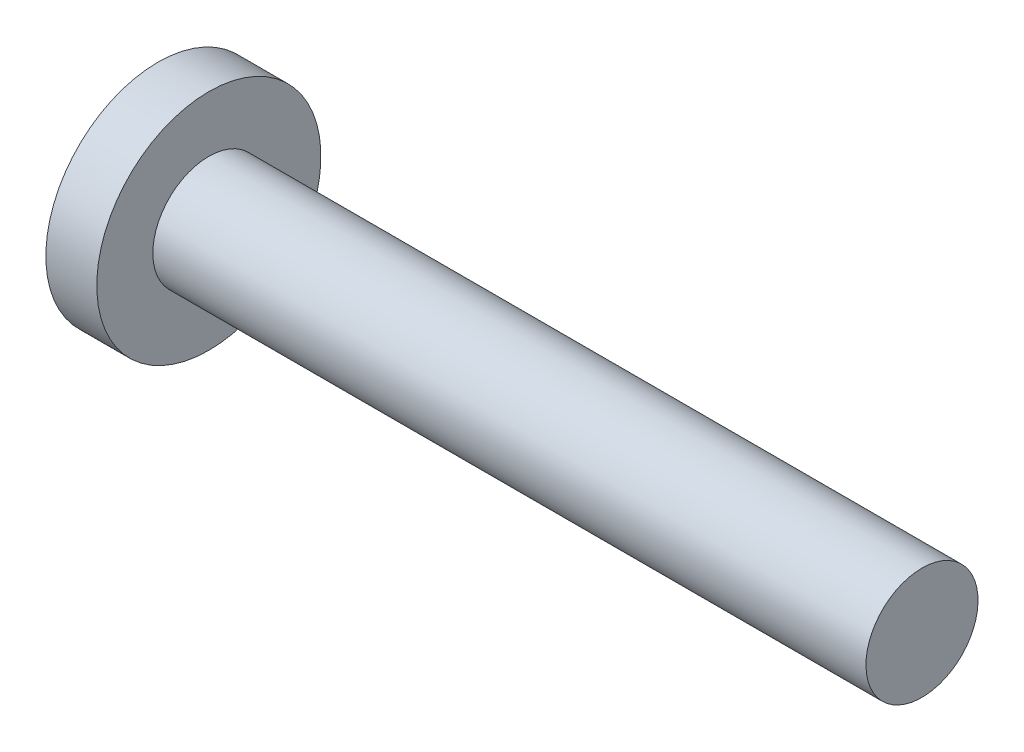
ISO-10303-21;
HEADER;
FILE_DESCRIPTION(('STEP AP214'),'2;1');
FILE_NAME('part.step','',(''),(''),'','','');
FILE_SCHEMA(('AUTOMOTIVE_DESIGN { 1 0 10303 214 1 1 1 1 }'));
ENDSEC;
DATA;
#1=APPLICATION_CONTEXT('core data for automotive mechanical design processes');
#2=APPLICATION_PROTOCOL_DEFINITION('international standard','automotive_design',2000,#1);
#3=PRODUCT_CONTEXT('',#1,'mechanical');
#4=PRODUCT('Part','Part','',(#3));
#5=PRODUCT_RELATED_PRODUCT_CATEGORY('part','',(#4));
#6=PRODUCT_DEFINITION_FORMATION('','',#4);
#7=PRODUCT_DEFINITION_CONTEXT('part definition',#1,'design');
#8=PRODUCT_DEFINITION('design','',#6,#7);
#9=PRODUCT_DEFINITION_SHAPE('','',#8);
#10=(LENGTH_UNIT() NAMED_UNIT(*) SI_UNIT(.MILLI.,.METRE.));
#11=(NAMED_UNIT(*) PLANE_ANGLE_UNIT() SI_UNIT($,.RADIAN.));
#12=(NAMED_UNIT(*) SI_UNIT($,.STERADIAN.) SOLID_ANGLE_UNIT());
#13=UNCERTAINTY_MEASURE_WITH_UNIT(LENGTH_MEASURE(1.E-05),#10,'distance_accuracy_value','');
#14=(GEOMETRIC_REPRESENTATION_CONTEXT(3) GLOBAL_UNCERTAINTY_ASSIGNED_CONTEXT((#13)) GLOBAL_UNIT_ASSIGNED_CONTEXT((#10,
#11,#12)) REPRESENTATION_CONTEXT('',''));
#15=CARTESIAN_POINT('',(0.,0.,0.));
#16=DIRECTION('',(0.,0.,1.));
#17=DIRECTION('',(1.,0.,0.));
#18=AXIS2_PLACEMENT_3D('',#15,#16,#17);
#19=CARTESIAN_POINT('',(0.,0.,0.));
#20=DIRECTION('',(-1.,0.,0.));
#21=DIRECTION('',(0.,-1.,0.));
#22=AXIS2_PLACEMENT_3D('',#19,#20,#21);
#23=PLANE('',#22);
#24=CARTESIAN_POINT('',(0.,0.,0.));
#25=DIRECTION('',(1.,0.,0.));
#26=DIRECTION('',(0.,1.,0.));
#27=AXIS2_PLACEMENT_3D('',#24,#25,#26);
#28=CIRCLE('',#27,22.);
#29=CARTESIAN_POINT('',(0.,22.,0.));
#30=VERTEX_POINT('',#29);
#31=EDGE_CURVE('E10',#30,#30,#28,.T.);
#32=ORIENTED_EDGE('',*,*,#31,.F.);
#33=EDGE_LOOP('',(#32));
#34=FACE_BOUND('',#33,.T.);
#35=ADVANCED_FACE('F34',(#34),#23,.T.);
#36=CARTESIAN_POINT('',(150.,0.,0.));
#37=DIRECTION('',(1.,0.,0.));
#38=DIRECTION('',(0.,1.,0.));
#39=AXIS2_PLACEMENT_3D('',#36,#37,#38);
#40=CYLINDRICAL_SURFACE('',#39,22.);
#41=ORIENTED_EDGE('',*,*,#31,.T.);
#42=EDGE_LOOP('',(#41));
#43=FACE_BOUND('',#42,.T.);
#44=CARTESIAN_POINT('',(10.,0.,0.));
#45=DIRECTION('',(1.,0.,0.));
#46=DIRECTION('',(0.,1.,0.));
#47=AXIS2_PLACEMENT_3D('',#44,#45,#46);
#48=CIRCLE('',#47,22.);
#49=CARTESIAN_POINT('',(10.,22.,0.));
#50=VERTEX_POINT('',#49);
#51=EDGE_CURVE('E40',#50,#50,#48,.T.);
#52=ORIENTED_EDGE('',*,*,#51,.F.);
#53=EDGE_LOOP('',(#52));
#54=FACE_BOUND('',#53,.T.);
#55=ADVANCED_FACE('F66',(#43,#54),#40,.T.);
#56=CARTESIAN_POINT('',(10.,22.,0.));
#57=DIRECTION('',(1.,0.,0.));
#58=DIRECTION('',(0.,1.,0.));
#59=AXIS2_PLACEMENT_3D('',#56,#57,#58);
#60=PLANE('',#59);
#61=ORIENTED_EDGE('',*,*,#51,.T.);
#62=EDGE_LOOP('',(#61));
#63=FACE_BOUND('',#62,.T.);
#64=CARTESIAN_POINT('',(10.,0.,0.));
#65=DIRECTION('',(1.,0.,0.));
#66=DIRECTION('',(0.,1.,0.));
#67=AXIS2_PLACEMENT_3D('',#64,#65,#66);
#68=CIRCLE('',#67,11.);
#69=CARTESIAN_POINT('',(10.,11.,0.));
#70=VERTEX_POINT('',#69);
#71=EDGE_CURVE('E44',#70,#70,#68,.T.);
#72=ORIENTED_EDGE('',*,*,#71,.F.);
#73=EDGE_LOOP('',(#72));
#74=FACE_BOUND('',#73,.T.);
#75=ADVANCED_FACE('F58',(#63,#74),#60,.T.);
#76=CARTESIAN_POINT('',(150.,0.,0.));
#77=DIRECTION('',(1.,0.,0.));
#78=DIRECTION('',(0.,1.,0.));
#79=AXIS2_PLACEMENT_3D('',#76,#77,#78);
#80=CYLINDRICAL_SURFACE('',#79,11.);
#81=ORIENTED_EDGE('',*,*,#71,.T.);
#82=EDGE_LOOP('',(#81));
#83=FACE_BOUND('',#82,.T.);
#84=CARTESIAN_POINT('',(150.,0.,0.));
#85=DIRECTION('',(1.,0.,0.));
#86=DIRECTION('',(0.,1.,0.));
#87=AXIS2_PLACEMENT_3D('',#84,#85,#86);
#88=CIRCLE('',#87,11.);
#89=CARTESIAN_POINT('',(150.,11.,0.));
#90=VERTEX_POINT('',#89);
#91=EDGE_CURVE('E48',#90,#90,#88,.T.);
#92=ORIENTED_EDGE('',*,*,#91,.F.);
#93=EDGE_LOOP('',(#92));
#94=FACE_BOUND('',#93,.T.);
#95=ADVANCED_FACE('F56',(#83,#94),#80,.T.);
#96=CARTESIAN_POINT('',(150.,11.,0.));
#97=DIRECTION('',(1.,0.,0.));
#98=DIRECTION('',(0.,1.,0.));
#99=AXIS2_PLACEMENT_3D('',#96,#97,#98);
#100=PLANE('',#99);
#101=ORIENTED_EDGE('',*,*,#91,.T.);
#102=EDGE_LOOP('',(#101));
#103=FACE_BOUND('',#102,.T.);
#104=ADVANCED_FACE('F54',(#103),#100,.T.);
#105=CLOSED_SHELL('',(#35,#55,#75,#95,#104));
#106=MANIFOLD_SOLID_BREP('B2',#105);
#107=ADVANCED_BREP_SHAPE_REPRESENTATION('',(#18,#106),#14);
#108=SHAPE_DEFINITION_REPRESENTATION(#9,#107);
ENDSEC;
END-ISO-10303-21;
